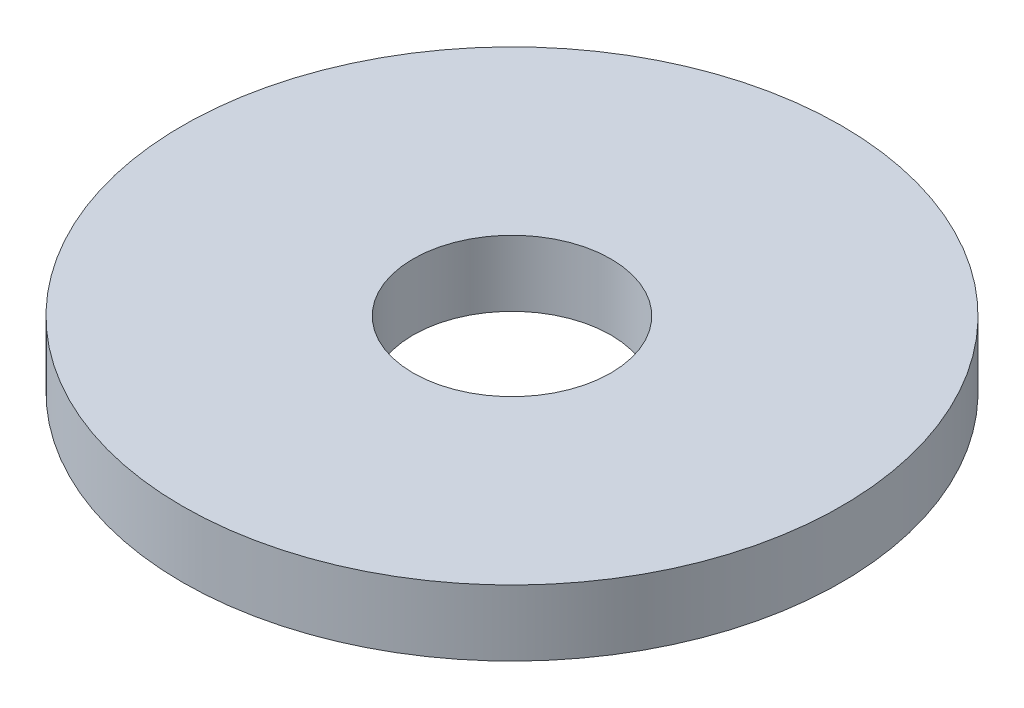
ISO-10303-21;
HEADER;
FILE_DESCRIPTION(('STEP AP214'),'2;1');
FILE_NAME('part.step','',(''),(''),'','','');
FILE_SCHEMA(('AUTOMOTIVE_DESIGN { 1 0 10303 214 1 1 1 1 }'));
ENDSEC;
DATA;
#1=APPLICATION_CONTEXT('core data for automotive mechanical design processes');
#2=APPLICATION_PROTOCOL_DEFINITION('international standard','automotive_design',2000,#1);
#3=PRODUCT_CONTEXT('',#1,'mechanical');
#4=PRODUCT('Part','Part','',(#3));
#5=PRODUCT_RELATED_PRODUCT_CATEGORY('part','',(#4));
#6=PRODUCT_DEFINITION_FORMATION('','',#4);
#7=PRODUCT_DEFINITION_CONTEXT('part definition',#1,'design');
#8=PRODUCT_DEFINITION('design','',#6,#7);
#9=PRODUCT_DEFINITION_SHAPE('','',#8);
#10=(LENGTH_UNIT() NAMED_UNIT(*) SI_UNIT(.MILLI.,.METRE.));
#11=(NAMED_UNIT(*) PLANE_ANGLE_UNIT() SI_UNIT($,.RADIAN.));
#12=(NAMED_UNIT(*) SI_UNIT($,.STERADIAN.) SOLID_ANGLE_UNIT());
#13=UNCERTAINTY_MEASURE_WITH_UNIT(LENGTH_MEASURE(1.E-05),#10,'distance_accuracy_value','');
#14=(GEOMETRIC_REPRESENTATION_CONTEXT(3) GLOBAL_UNCERTAINTY_ASSIGNED_CONTEXT((#13)) GLOBAL_UNIT_ASSIGNED_CONTEXT((#10,
#11,#12)) REPRESENTATION_CONTEXT('',''));
#15=CARTESIAN_POINT('',(0.,0.,0.));
#16=DIRECTION('',(0.,0.,1.));
#17=DIRECTION('',(1.,0.,0.));
#18=AXIS2_PLACEMENT_3D('',#15,#16,#17);
#19=CARTESIAN_POINT('',(0.,1.,0.));
#20=DIRECTION('',(0.,-1.,0.));
#21=DIRECTION('',(0.,0.,-1.));
#22=AXIS2_PLACEMENT_3D('',#19,#20,#21);
#23=CYLINDRICAL_SURFACE('',#22,5.);
#24=CARTESIAN_POINT('',(0.,1.,0.));
#25=DIRECTION('',(0.,1.,0.));
#26=DIRECTION('',(0.,0.,1.));
#27=AXIS2_PLACEMENT_3D('',#24,#25,#26);
#28=CIRCLE('',#27,5.);
#29=CARTESIAN_POINT('',(0.,1.,5.));
#30=VERTEX_POINT('',#29);
#31=EDGE_CURVE('E10',#30,#30,#28,.T.);
#32=ORIENTED_EDGE('',*,*,#31,.F.);
#33=EDGE_LOOP('',(#32));
#34=FACE_BOUND('',#33,.T.);
#35=CARTESIAN_POINT('',(0.,0.,0.));
#36=DIRECTION('',(0.,1.,0.));
#37=DIRECTION('',(0.,0.,1.));
#38=AXIS2_PLACEMENT_3D('',#35,#36,#37);
#39=CIRCLE('',#38,5.);
#40=CARTESIAN_POINT('',(0.,0.,5.));
#41=VERTEX_POINT('',#40);
#42=EDGE_CURVE('E40',#41,#41,#39,.T.);
#43=ORIENTED_EDGE('',*,*,#42,.T.);
#44=EDGE_LOOP('',(#43));
#45=FACE_BOUND('',#44,.T.);
#46=ADVANCED_FACE('F37',(#34,#45),#23,.T.);
#47=CARTESIAN_POINT('',(0.,1.,0.));
#48=DIRECTION('',(0.,1.,0.));
#49=DIRECTION('',(0.,0.,1.));
#50=AXIS2_PLACEMENT_3D('',#47,#48,#49);
#51=PLANE('',#50);
#52=CARTESIAN_POINT('',(0.,1.,0.));
#53=DIRECTION('',(0.,1.,0.));
#54=DIRECTION('',(0.,0.,1.));
#55=AXIS2_PLACEMENT_3D('',#52,#53,#54);
#56=CIRCLE('',#55,1.5);
#57=CARTESIAN_POINT('',(0.,1.,1.5));
#58=VERTEX_POINT('',#57);
#59=EDGE_CURVE('E51',#58,#58,#56,.T.);
#60=ORIENTED_EDGE('',*,*,#59,.F.);
#61=EDGE_LOOP('',(#60));
#62=FACE_BOUND('',#61,.T.);
#63=ORIENTED_EDGE('',*,*,#31,.T.);
#64=EDGE_LOOP('',(#63));
#65=FACE_BOUND('',#64,.T.);
#66=ADVANCED_FACE('F68',(#62,#65),#51,.T.);
#67=CARTESIAN_POINT('',(0.,0.,0.));
#68=DIRECTION('',(0.,1.,0.));
#69=DIRECTION('',(0.,0.,1.));
#70=AXIS2_PLACEMENT_3D('',#67,#68,#69);
#71=PLANE('',#70);
#72=CARTESIAN_POINT('',(0.,0.,0.));
#73=DIRECTION('',(0.,1.,0.));
#74=DIRECTION('',(0.,0.,1.));
#75=AXIS2_PLACEMENT_3D('',#72,#73,#74);
#76=CIRCLE('',#75,1.5);
#77=CARTESIAN_POINT('',(0.,0.,1.5));
#78=VERTEX_POINT('',#77);
#79=EDGE_CURVE('E49',#78,#78,#76,.T.);
#80=ORIENTED_EDGE('',*,*,#79,.T.);
#81=EDGE_LOOP('',(#80));
#82=FACE_BOUND('',#81,.T.);
#83=ORIENTED_EDGE('',*,*,#42,.F.);
#84=EDGE_LOOP('',(#83));
#85=FACE_BOUND('',#84,.T.);
#86=ADVANCED_FACE('F59',(#82,#85),#71,.F.);
#87=CARTESIAN_POINT('',(0.,0.,0.));
#88=DIRECTION('',(0.,1.,0.));
#89=DIRECTION('',(0.,0.,1.));
#90=AXIS2_PLACEMENT_3D('',#87,#88,#89);
#91=CYLINDRICAL_SURFACE('',#90,1.5);
#92=ORIENTED_EDGE('',*,*,#79,.F.);
#93=EDGE_LOOP('',(#92));
#94=FACE_BOUND('',#93,.T.);
#95=ORIENTED_EDGE('',*,*,#59,.T.);
#96=EDGE_LOOP('',(#95));
#97=FACE_BOUND('',#96,.T.);
#98=ADVANCED_FACE('F62',(#94,#97),#91,.F.);
#99=CLOSED_SHELL('',(#46,#66,#86,#98));
#100=MANIFOLD_SOLID_BREP('B2',#99);
#101=ADVANCED_BREP_SHAPE_REPRESENTATION('',(#18,#100),#14);
#102=SHAPE_DEFINITION_REPRESENTATION(#9,#101);
ENDSEC;
END-ISO-10303-21;
